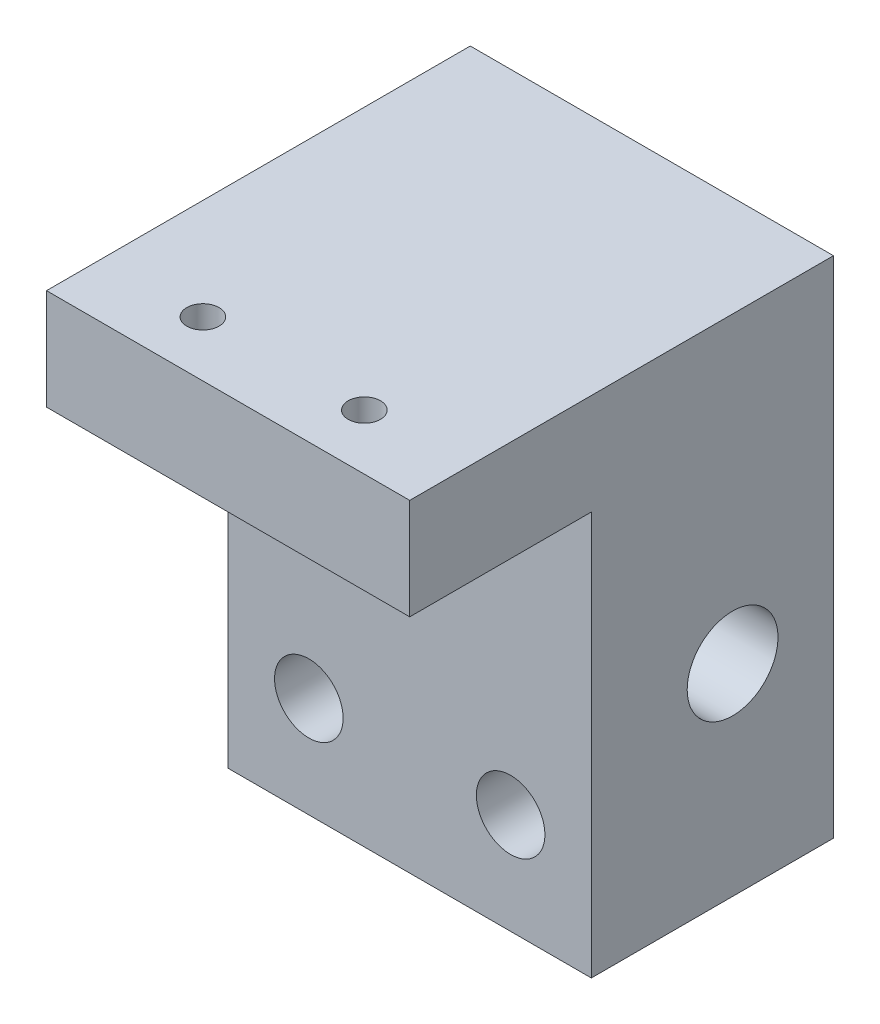
ISO-10303-21;
HEADER;
FILE_DESCRIPTION(('STEP AP214'),'2;1');
FILE_NAME('part.step','',(''),(''),'','','');
FILE_SCHEMA(('AUTOMOTIVE_DESIGN { 1 0 10303 214 1 1 1 1 }'));
ENDSEC;
DATA;
#1=APPLICATION_CONTEXT('core data for automotive mechanical design processes');
#2=APPLICATION_PROTOCOL_DEFINITION('international standard','automotive_design',2000,#1);
#3=PRODUCT_CONTEXT('',#1,'mechanical');
#4=PRODUCT('Part','Part','',(#3));
#5=PRODUCT_RELATED_PRODUCT_CATEGORY('part','',(#4));
#6=PRODUCT_DEFINITION_FORMATION('','',#4);
#7=PRODUCT_DEFINITION_CONTEXT('part definition',#1,'design');
#8=PRODUCT_DEFINITION('design','',#6,#7);
#9=PRODUCT_DEFINITION_SHAPE('','',#8);
#10=(LENGTH_UNIT() NAMED_UNIT(*) SI_UNIT(.MILLI.,.METRE.));
#11=(NAMED_UNIT(*) PLANE_ANGLE_UNIT() SI_UNIT($,.RADIAN.));
#12=(NAMED_UNIT(*) SI_UNIT($,.STERADIAN.) SOLID_ANGLE_UNIT());
#13=UNCERTAINTY_MEASURE_WITH_UNIT(LENGTH_MEASURE(1.E-05),#10,'distance_accuracy_value','');
#14=(GEOMETRIC_REPRESENTATION_CONTEXT(3) GLOBAL_UNCERTAINTY_ASSIGNED_CONTEXT((#13)) GLOBAL_UNIT_ASSIGNED_CONTEXT((#10,
#11,#12)) REPRESENTATION_CONTEXT('',''));
#15=CARTESIAN_POINT('',(0.,0.,0.));
#16=DIRECTION('',(0.,0.,1.));
#17=DIRECTION('',(1.,0.,0.));
#18=AXIS2_PLACEMENT_3D('',#15,#16,#17);
#19=CARTESIAN_POINT('',(0.,50.,0.));
#20=DIRECTION('',(0.,0.,-1.));
#21=DIRECTION('',(-1.,0.,0.));
#22=AXIS2_PLACEMENT_3D('',#19,#20,#21);
#23=PLANE('',#22);
#24=CARTESIAN_POINT('',(28.,10.,0.));
#25=DIRECTION('',(0.,0.,1.));
#26=DIRECTION('',(1.,0.,0.));
#27=AXIS2_PLACEMENT_3D('',#24,#25,#26);
#28=CIRCLE('',#27,3.4);
#29=CARTESIAN_POINT('',(31.4,10.,0.));
#30=VERTEX_POINT('',#29);
#31=EDGE_CURVE('E132',#30,#30,#28,.T.);
#32=ORIENTED_EDGE('',*,*,#31,.F.);
#33=EDGE_LOOP('',(#32));
#34=FACE_BOUND('',#33,.T.);
#35=CARTESIAN_POINT('',(8.,10.,0.));
#36=DIRECTION('',(0.,0.,1.));
#37=DIRECTION('',(1.,0.,0.));
#38=AXIS2_PLACEMENT_3D('',#35,#36,#37);
#39=CIRCLE('',#38,3.4);
#40=CARTESIAN_POINT('',(11.4,10.,0.));
#41=VERTEX_POINT('',#40);
#42=EDGE_CURVE('E149',#41,#41,#39,.T.);
#43=ORIENTED_EDGE('',*,*,#42,.F.);
#44=EDGE_LOOP('',(#43));
#45=FACE_BOUND('',#44,.T.);
#46=DIRECTION('',(1.,0.,0.));
#47=VECTOR('',#46,1.);
#48=CARTESIAN_POINT('',(-20.591260281974,40.,0.));
#49=LINE('',#48,#47);
#50=CARTESIAN_POINT('',(0.,40.,0.));
#51=VERTEX_POINT('',#50);
#52=CARTESIAN_POINT('',(36.,40.,0.));
#53=VERTEX_POINT('',#52);
#54=EDGE_CURVE('E53',#51,#53,#49,.T.);
#55=ORIENTED_EDGE('',*,*,#54,.F.);
#56=DIRECTION('',(0.,-1.,0.));
#57=VECTOR('',#56,1.);
#58=CARTESIAN_POINT('',(0.,50.,0.));
#59=LINE('',#58,#57);
#60=CARTESIAN_POINT('',(0.,0.,0.));
#61=VERTEX_POINT('',#60);
#62=EDGE_CURVE('E11',#51,#61,#59,.T.);
#63=ORIENTED_EDGE('',*,*,#62,.T.);
#64=DIRECTION('',(1.,0.,0.));
#65=VECTOR('',#64,1.);
#66=CARTESIAN_POINT('',(0.,0.,0.));
#67=LINE('',#66,#65);
#68=CARTESIAN_POINT('',(36.,0.,0.));
#69=VERTEX_POINT('',#68);
#70=EDGE_CURVE('E101',#61,#69,#67,.T.);
#71=ORIENTED_EDGE('',*,*,#70,.T.);
#72=DIRECTION('',(0.,-1.,0.));
#73=VECTOR('',#72,1.);
#74=CARTESIAN_POINT('',(36.,50.,0.));
#75=LINE('',#74,#73);
#76=EDGE_CURVE('E47',#53,#69,#75,.T.);
#77=ORIENTED_EDGE('',*,*,#76,.F.);
#78=EDGE_LOOP('',(#55,#63,#71,#77));
#79=FACE_BOUND('',#78,.T.);
#80=ADVANCED_FACE('F39',(#34,#45,#79),#23,.F.);
#81=CARTESIAN_POINT('',(0.,50.,0.));
#82=DIRECTION('',(1.,0.,0.));
#83=DIRECTION('',(0.,0.,-1.));
#84=AXIS2_PLACEMENT_3D('',#81,#82,#83);
#85=PLANE('',#84);
#86=CARTESIAN_POINT('',(0.,20.,-14.));
#87=DIRECTION('',(-1.,0.,0.));
#88=DIRECTION('',(0.,0.,1.));
#89=AXIS2_PLACEMENT_3D('',#86,#87,#88);
#90=CIRCLE('',#89,4.5);
#91=CARTESIAN_POINT('',(0.,20.,-9.5));
#92=VERTEX_POINT('',#91);
#93=EDGE_CURVE('E106',#92,#92,#90,.T.);
#94=ORIENTED_EDGE('',*,*,#93,.F.);
#95=EDGE_LOOP('',(#94));
#96=FACE_BOUND('',#95,.T.);
#97=DIRECTION('',(0.,0.,1.));
#98=VECTOR('',#97,1.);
#99=CARTESIAN_POINT('',(0.,0.,0.));
#100=LINE('',#99,#98);
#101=CARTESIAN_POINT('',(0.,0.,-24.));
#102=VERTEX_POINT('',#101);
#103=EDGE_CURVE('E95',#102,#61,#100,.T.);
#104=ORIENTED_EDGE('',*,*,#103,.T.);
#105=ORIENTED_EDGE('',*,*,#62,.F.);
#106=DIRECTION('',(0.,0.,1.));
#107=VECTOR('',#106,1.);
#108=CARTESIAN_POINT('',(0.,40.,0.));
#109=LINE('',#108,#107);
#110=CARTESIAN_POINT('',(0.,40.,18.));
#111=VERTEX_POINT('',#110);
#112=EDGE_CURVE('E121',#51,#111,#109,.T.);
#113=ORIENTED_EDGE('',*,*,#112,.T.);
#114=DIRECTION('',(0.,1.,0.));
#115=VECTOR('',#114,1.);
#116=CARTESIAN_POINT('',(0.,50.,18.));
#117=LINE('',#116,#115);
#118=CARTESIAN_POINT('',(0.,50.,18.));
#119=VERTEX_POINT('',#118);
#120=EDGE_CURVE('E129',#111,#119,#117,.T.);
#121=ORIENTED_EDGE('',*,*,#120,.T.);
#122=DIRECTION('',(0.,0.,1.));
#123=VECTOR('',#122,1.);
#124=CARTESIAN_POINT('',(0.,50.,0.));
#125=LINE('',#124,#123);
#126=CARTESIAN_POINT('',(0.,50.,-24.));
#127=VERTEX_POINT('',#126);
#128=EDGE_CURVE('E90',#127,#119,#125,.T.);
#129=ORIENTED_EDGE('',*,*,#128,.F.);
#130=DIRECTION('',(0.,-1.,0.));
#131=VECTOR('',#130,1.);
#132=CARTESIAN_POINT('',(0.,50.,-24.));
#133=LINE('',#132,#131);
#134=EDGE_CURVE('E83',#127,#102,#133,.T.);
#135=ORIENTED_EDGE('',*,*,#134,.T.);
#136=EDGE_LOOP('',(#104,#105,#113,#121,#129,#135));
#137=FACE_BOUND('',#136,.T.);
#138=ADVANCED_FACE('F41',(#96,#137),#85,.F.);
#139=CARTESIAN_POINT('',(36.,50.,0.));
#140=DIRECTION('',(-1.,0.,0.));
#141=DIRECTION('',(0.,0.,1.));
#142=AXIS2_PLACEMENT_3D('',#139,#140,#141);
#143=PLANE('',#142);
#144=CARTESIAN_POINT('',(36.,20.,-14.));
#145=DIRECTION('',(-1.,0.,0.));
#146=DIRECTION('',(0.,0.,1.));
#147=AXIS2_PLACEMENT_3D('',#144,#145,#146);
#148=CIRCLE('',#147,4.5);
#149=CARTESIAN_POINT('',(36.,20.,-9.5));
#150=VERTEX_POINT('',#149);
#151=EDGE_CURVE('E102',#150,#150,#148,.F.);
#152=ORIENTED_EDGE('',*,*,#151,.F.);
#153=EDGE_LOOP('',(#152));
#154=FACE_BOUND('',#153,.T.);
#155=DIRECTION('',(0.,0.,-1.));
#156=VECTOR('',#155,1.);
#157=CARTESIAN_POINT('',(36.,0.,0.));
#158=LINE('',#157,#156);
#159=CARTESIAN_POINT('',(36.,0.,-24.));
#160=VERTEX_POINT('',#159);
#161=EDGE_CURVE('E91',#69,#160,#158,.T.);
#162=ORIENTED_EDGE('',*,*,#161,.T.);
#163=DIRECTION('',(0.,-1.,0.));
#164=VECTOR('',#163,1.);
#165=CARTESIAN_POINT('',(36.,50.,-24.));
#166=LINE('',#165,#164);
#167=CARTESIAN_POINT('',(36.,50.,-24.));
#168=VERTEX_POINT('',#167);
#169=EDGE_CURVE('E86',#168,#160,#166,.T.);
#170=ORIENTED_EDGE('',*,*,#169,.F.);
#171=DIRECTION('',(0.,0.,-1.));
#172=VECTOR('',#171,1.);
#173=CARTESIAN_POINT('',(36.,50.,0.));
#174=LINE('',#173,#172);
#175=CARTESIAN_POINT('',(36.,50.,18.));
#176=VERTEX_POINT('',#175);
#177=EDGE_CURVE('E156',#176,#168,#174,.T.);
#178=ORIENTED_EDGE('',*,*,#177,.F.);
#179=DIRECTION('',(0.,-1.,0.));
#180=VECTOR('',#179,1.);
#181=CARTESIAN_POINT('',(36.,50.,18.));
#182=LINE('',#181,#180);
#183=CARTESIAN_POINT('',(36.,40.,18.));
#184=VERTEX_POINT('',#183);
#185=EDGE_CURVE('E137',#176,#184,#182,.T.);
#186=ORIENTED_EDGE('',*,*,#185,.T.);
#187=DIRECTION('',(0.,0.,-1.));
#188=VECTOR('',#187,1.);
#189=CARTESIAN_POINT('',(36.,40.,0.));
#190=LINE('',#189,#188);
#191=EDGE_CURVE('E118',#184,#53,#190,.T.);
#192=ORIENTED_EDGE('',*,*,#191,.T.);
#193=ORIENTED_EDGE('',*,*,#76,.T.);
#194=EDGE_LOOP('',(#162,#170,#178,#186,#192,#193));
#195=FACE_BOUND('',#194,.T.);
#196=ADVANCED_FACE('F114',(#154,#195),#143,.F.);
#197=CARTESIAN_POINT('',(0.,50.,-24.));
#198=DIRECTION('',(0.,0.,1.));
#199=DIRECTION('',(1.,0.,0.));
#200=AXIS2_PLACEMENT_3D('',#197,#198,#199);
#201=PLANE('',#200);
#202=DIRECTION('',(-1.,0.,0.));
#203=VECTOR('',#202,1.);
#204=CARTESIAN_POINT('',(0.,0.,-24.));
#205=LINE('',#204,#203);
#206=EDGE_CURVE('E80',#160,#102,#205,.T.);
#207=ORIENTED_EDGE('',*,*,#206,.T.);
#208=ORIENTED_EDGE('',*,*,#134,.F.);
#209=DIRECTION('',(-1.,0.,0.));
#210=VECTOR('',#209,1.);
#211=CARTESIAN_POINT('',(0.,50.,-24.));
#212=LINE('',#211,#210);
#213=EDGE_CURVE('E62',#168,#127,#212,.T.);
#214=ORIENTED_EDGE('',*,*,#213,.F.);
#215=ORIENTED_EDGE('',*,*,#169,.T.);
#216=EDGE_LOOP('',(#207,#208,#214,#215));
#217=FACE_BOUND('',#216,.T.);
#218=ADVANCED_FACE('F82',(#217),#201,.F.);
#219=CARTESIAN_POINT('',(0.,50.,0.));
#220=DIRECTION('',(0.,-1.,0.));
#221=DIRECTION('',(0.,0.,-1.));
#222=AXIS2_PLACEMENT_3D('',#219,#220,#221);
#223=PLANE('',#222);
#224=CARTESIAN_POINT('',(26.,50.,12.5));
#225=DIRECTION('',(0.,1.,0.));
#226=DIRECTION('',(0.,0.,1.));
#227=AXIS2_PLACEMENT_3D('',#224,#225,#226);
#228=CIRCLE('',#227,1.6);
#229=CARTESIAN_POINT('',(26.,50.,14.1));
#230=VERTEX_POINT('',#229);
#231=EDGE_CURVE('E376',#230,#230,#228,.T.);
#232=ORIENTED_EDGE('',*,*,#231,.F.);
#233=EDGE_LOOP('',(#232));
#234=FACE_BOUND('',#233,.T.);
#235=CARTESIAN_POINT('',(10.,50.,12.5));
#236=DIRECTION('',(0.,1.,0.));
#237=DIRECTION('',(0.,0.,1.));
#238=AXIS2_PLACEMENT_3D('',#235,#236,#237);
#239=CIRCLE('',#238,1.6);
#240=CARTESIAN_POINT('',(10.,50.,14.1));
#241=VERTEX_POINT('',#240);
#242=EDGE_CURVE('E379',#241,#241,#239,.T.);
#243=ORIENTED_EDGE('',*,*,#242,.F.);
#244=EDGE_LOOP('',(#243));
#245=FACE_BOUND('',#244,.T.);
#246=ORIENTED_EDGE('',*,*,#128,.T.);
#247=DIRECTION('',(1.,0.,0.));
#248=VECTOR('',#247,1.);
#249=CARTESIAN_POINT('',(-20.591260281974,50.,18.));
#250=LINE('',#249,#248);
#251=EDGE_CURVE('E141',#119,#176,#250,.T.);
#252=ORIENTED_EDGE('',*,*,#251,.T.);
#253=ORIENTED_EDGE('',*,*,#177,.T.);
#254=ORIENTED_EDGE('',*,*,#213,.T.);
#255=EDGE_LOOP('',(#246,#252,#253,#254));
#256=FACE_BOUND('',#255,.T.);
#257=ADVANCED_FACE('F158',(#234,#245,#256),#223,.F.);
#258=CARTESIAN_POINT('',(0.,0.,0.));
#259=DIRECTION('',(0.,-1.,0.));
#260=DIRECTION('',(0.,0.,-1.));
#261=AXIS2_PLACEMENT_3D('',#258,#259,#260);
#262=PLANE('',#261);
#263=ORIENTED_EDGE('',*,*,#103,.F.);
#264=ORIENTED_EDGE('',*,*,#206,.F.);
#265=ORIENTED_EDGE('',*,*,#161,.F.);
#266=ORIENTED_EDGE('',*,*,#70,.F.);
#267=EDGE_LOOP('',(#263,#264,#265,#266));
#268=FACE_BOUND('',#267,.T.);
#269=ADVANCED_FACE('F99',(#268),#262,.T.);
#270=CARTESIAN_POINT('',(48.7279220613579,20.,-14.));
#271=DIRECTION('',(-1.,0.,0.));
#272=DIRECTION('',(0.,0.,1.));
#273=AXIS2_PLACEMENT_3D('',#270,#271,#272);
#274=CYLINDRICAL_SURFACE('',#273,4.5);
#275=ORIENTED_EDGE('',*,*,#151,.T.);
#276=EDGE_LOOP('',(#275));
#277=FACE_BOUND('',#276,.T.);
#278=ORIENTED_EDGE('',*,*,#93,.T.);
#279=EDGE_LOOP('',(#278));
#280=FACE_BOUND('',#279,.T.);
#281=ADVANCED_FACE('F199',(#277,#280),#274,.F.);
#282=CARTESIAN_POINT('',(28.,10.,-6.));
#283=DIRECTION('',(0.,0.,1.));
#284=DIRECTION('',(1.,0.,0.));
#285=AXIS2_PLACEMENT_3D('',#282,#283,#284);
#286=CYLINDRICAL_SURFACE('',#285,3.4);
#287=CARTESIAN_POINT('',(28.,10.,-6.));
#288=DIRECTION('',(0.,0.,1.));
#289=DIRECTION('',(1.,0.,0.));
#290=AXIS2_PLACEMENT_3D('',#287,#288,#289);
#291=CIRCLE('',#290,3.4);
#292=CARTESIAN_POINT('',(31.4,10.,-6.));
#293=VERTEX_POINT('',#292);
#294=EDGE_CURVE('E128',#293,#293,#291,.T.);
#295=ORIENTED_EDGE('',*,*,#294,.F.);
#296=EDGE_LOOP('',(#295));
#297=FACE_BOUND('',#296,.T.);
#298=ORIENTED_EDGE('',*,*,#31,.T.);
#299=EDGE_LOOP('',(#298));
#300=FACE_BOUND('',#299,.T.);
#301=ADVANCED_FACE('F205',(#297,#300),#286,.F.);
#302=CARTESIAN_POINT('',(28.,10.,-6.));
#303=DIRECTION('',(0.,0.,1.));
#304=DIRECTION('',(1.,0.,0.));
#305=AXIS2_PLACEMENT_3D('',#302,#303,#304);
#306=PLANE('',#305);
#307=ORIENTED_EDGE('',*,*,#294,.T.);
#308=EDGE_LOOP('',(#307));
#309=FACE_BOUND('',#308,.T.);
#310=ADVANCED_FACE('F207',(#309),#306,.T.);
#311=CARTESIAN_POINT('',(8.,10.,-6.));
#312=DIRECTION('',(0.,0.,1.));
#313=DIRECTION('',(1.,0.,0.));
#314=AXIS2_PLACEMENT_3D('',#311,#312,#313);
#315=CYLINDRICAL_SURFACE('',#314,3.4);
#316=CARTESIAN_POINT('',(8.,10.,-6.));
#317=DIRECTION('',(0.,0.,1.));
#318=DIRECTION('',(1.,0.,0.));
#319=AXIS2_PLACEMENT_3D('',#316,#317,#318);
#320=CIRCLE('',#319,3.4);
#321=CARTESIAN_POINT('',(11.4,10.,-6.));
#322=VERTEX_POINT('',#321);
#323=EDGE_CURVE('E146',#322,#322,#320,.T.);
#324=ORIENTED_EDGE('',*,*,#323,.F.);
#325=EDGE_LOOP('',(#324));
#326=FACE_BOUND('',#325,.T.);
#327=ORIENTED_EDGE('',*,*,#42,.T.);
#328=EDGE_LOOP('',(#327));
#329=FACE_BOUND('',#328,.T.);
#330=ADVANCED_FACE('F210',(#326,#329),#315,.F.);
#331=CARTESIAN_POINT('',(8.,10.,-6.));
#332=DIRECTION('',(0.,0.,1.));
#333=DIRECTION('',(1.,0.,0.));
#334=AXIS2_PLACEMENT_3D('',#331,#332,#333);
#335=PLANE('',#334);
#336=ORIENTED_EDGE('',*,*,#323,.T.);
#337=EDGE_LOOP('',(#336));
#338=FACE_BOUND('',#337,.T.);
#339=ADVANCED_FACE('F180',(#338),#335,.T.);
#340=CARTESIAN_POINT('',(-20.591260281974,40.,0.));
#341=DIRECTION('',(0.,-1.,0.));
#342=DIRECTION('',(0.,0.,-1.));
#343=AXIS2_PLACEMENT_3D('',#340,#341,#342);
#344=PLANE('',#343);
#345=ORIENTED_EDGE('',*,*,#112,.F.);
#346=ORIENTED_EDGE('',*,*,#54,.T.);
#347=ORIENTED_EDGE('',*,*,#191,.F.);
#348=DIRECTION('',(1.,0.,0.));
#349=VECTOR('',#348,1.);
#350=CARTESIAN_POINT('',(-20.591260281974,40.,18.));
#351=LINE('',#350,#349);
#352=EDGE_CURVE('E127',#111,#184,#351,.T.);
#353=ORIENTED_EDGE('',*,*,#352,.F.);
#354=EDGE_LOOP('',(#345,#346,#347,#353));
#355=FACE_BOUND('',#354,.T.);
#356=ADVANCED_FACE('F125',(#355),#344,.T.);
#357=CARTESIAN_POINT('',(-20.591260281974,50.,18.));
#358=DIRECTION('',(0.,0.,1.));
#359=DIRECTION('',(1.,0.,0.));
#360=AXIS2_PLACEMENT_3D('',#357,#358,#359);
#361=PLANE('',#360);
#362=ORIENTED_EDGE('',*,*,#120,.F.);
#363=ORIENTED_EDGE('',*,*,#352,.T.);
#364=ORIENTED_EDGE('',*,*,#185,.F.);
#365=ORIENTED_EDGE('',*,*,#251,.F.);
#366=EDGE_LOOP('',(#362,#363,#364,#365));
#367=FACE_BOUND('',#366,.T.);
#368=ADVANCED_FACE('F169',(#367),#361,.T.);
#369=CARTESIAN_POINT('',(10.,45.,12.5));
#370=DIRECTION('',(0.,1.,0.));
#371=DIRECTION('',(0.,0.,1.));
#372=AXIS2_PLACEMENT_3D('',#369,#370,#371);
#373=CYLINDRICAL_SURFACE('',#372,1.6);
#374=CARTESIAN_POINT('',(10.,45.,12.5));
#375=DIRECTION('',(0.,1.,0.));
#376=DIRECTION('',(0.,0.,1.));
#377=AXIS2_PLACEMENT_3D('',#374,#375,#376);
#378=CIRCLE('',#377,1.6);
#379=CARTESIAN_POINT('',(10.,45.,14.1));
#380=VERTEX_POINT('',#379);
#381=EDGE_CURVE('E383',#380,#380,#378,.T.);
#382=ORIENTED_EDGE('',*,*,#381,.F.);
#383=EDGE_LOOP('',(#382));
#384=FACE_BOUND('',#383,.T.);
#385=ORIENTED_EDGE('',*,*,#242,.T.);
#386=EDGE_LOOP('',(#385));
#387=FACE_BOUND('',#386,.T.);
#388=ADVANCED_FACE('F171',(#384,#387),#373,.F.);
#389=CARTESIAN_POINT('',(10.,45.,12.5));
#390=DIRECTION('',(0.,1.,0.));
#391=DIRECTION('',(0.,0.,1.));
#392=AXIS2_PLACEMENT_3D('',#389,#390,#391);
#393=PLANE('',#392);
#394=ORIENTED_EDGE('',*,*,#381,.T.);
#395=EDGE_LOOP('',(#394));
#396=FACE_BOUND('',#395,.T.);
#397=ADVANCED_FACE('F177',(#396),#393,.T.);
#398=CARTESIAN_POINT('',(26.,45.,12.5));
#399=DIRECTION('',(0.,1.,0.));
#400=DIRECTION('',(0.,0.,1.));
#401=AXIS2_PLACEMENT_3D('',#398,#399,#400);
#402=CYLINDRICAL_SURFACE('',#401,1.6);
#403=CARTESIAN_POINT('',(26.,45.,12.5));
#404=DIRECTION('',(0.,1.,0.));
#405=DIRECTION('',(0.,0.,1.));
#406=AXIS2_PLACEMENT_3D('',#403,#404,#405);
#407=CIRCLE('',#406,1.6);
#408=CARTESIAN_POINT('',(26.,45.,14.1));
#409=VERTEX_POINT('',#408);
#410=EDGE_CURVE('E139',#409,#409,#407,.T.);
#411=ORIENTED_EDGE('',*,*,#410,.F.);
#412=EDGE_LOOP('',(#411));
#413=FACE_BOUND('',#412,.T.);
#414=ORIENTED_EDGE('',*,*,#231,.T.);
#415=EDGE_LOOP('',(#414));
#416=FACE_BOUND('',#415,.T.);
#417=ADVANCED_FACE('F263',(#413,#416),#402,.F.);
#418=CARTESIAN_POINT('',(26.,45.,12.5));
#419=DIRECTION('',(0.,1.,0.));
#420=DIRECTION('',(0.,0.,1.));
#421=AXIS2_PLACEMENT_3D('',#418,#419,#420);
#422=PLANE('',#421);
#423=ORIENTED_EDGE('',*,*,#410,.T.);
#424=EDGE_LOOP('',(#423));
#425=FACE_BOUND('',#424,.T.);
#426=ADVANCED_FACE('F274',(#425),#422,.T.);
#427=CLOSED_SHELL('',(#80,#138,#196,#218,#257,#269,#281,#301,#310,#330,#339,#356,#368,#388,#397,
#417,#426));
#428=MANIFOLD_SOLID_BREP('B2',#427);
#429=ADVANCED_BREP_SHAPE_REPRESENTATION('',(#18,#428),#14);
#430=SHAPE_DEFINITION_REPRESENTATION(#9,#429);
ENDSEC;
END-ISO-10303-21;
